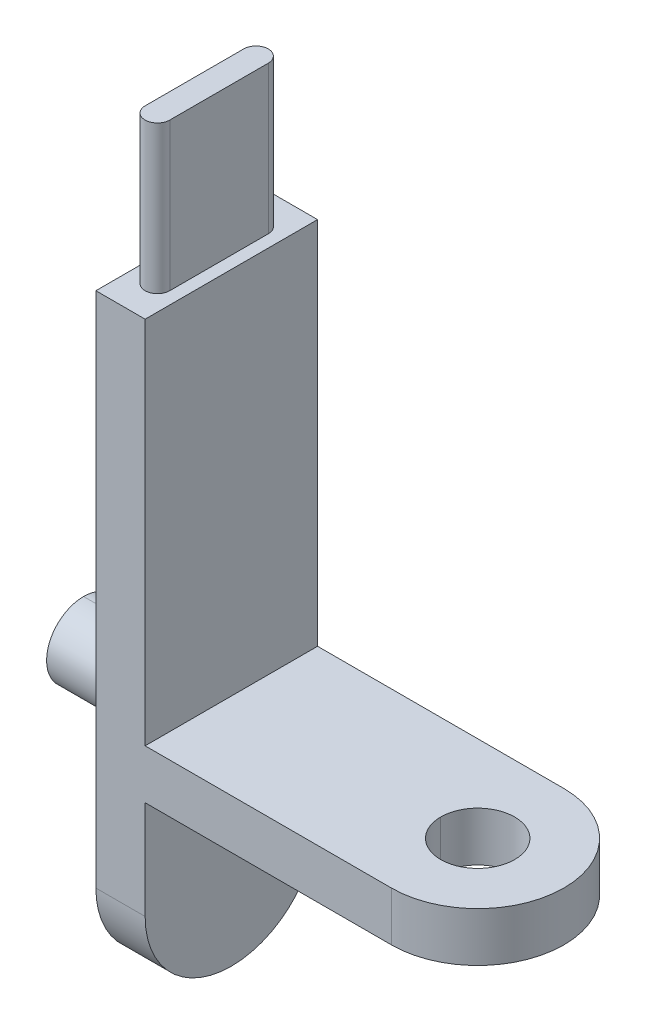
ISO-10303-21;
HEADER;
FILE_DESCRIPTION(('STEP AP214'),'2;1');
FILE_NAME('part.step','',(''),(''),'','','');
FILE_SCHEMA(('AUTOMOTIVE_DESIGN { 1 0 10303 214 1 1 1 1 }'));
ENDSEC;
DATA;
#1=APPLICATION_CONTEXT('core data for automotive mechanical design processes');
#2=APPLICATION_PROTOCOL_DEFINITION('international standard','automotive_design',2000,#1);
#3=PRODUCT_CONTEXT('',#1,'mechanical');
#4=PRODUCT('Part','Part','',(#3));
#5=PRODUCT_RELATED_PRODUCT_CATEGORY('part','',(#4));
#6=PRODUCT_DEFINITION_FORMATION('','',#4);
#7=PRODUCT_DEFINITION_CONTEXT('part definition',#1,'design');
#8=PRODUCT_DEFINITION('design','',#6,#7);
#9=PRODUCT_DEFINITION_SHAPE('','',#8);
#10=(LENGTH_UNIT() NAMED_UNIT(*) SI_UNIT(.MILLI.,.METRE.));
#11=(NAMED_UNIT(*) PLANE_ANGLE_UNIT() SI_UNIT($,.RADIAN.));
#12=(NAMED_UNIT(*) SI_UNIT($,.STERADIAN.) SOLID_ANGLE_UNIT());
#13=UNCERTAINTY_MEASURE_WITH_UNIT(LENGTH_MEASURE(1.E-05),#10,'distance_accuracy_value','');
#14=(GEOMETRIC_REPRESENTATION_CONTEXT(3) GLOBAL_UNCERTAINTY_ASSIGNED_CONTEXT((#13)) GLOBAL_UNIT_ASSIGNED_CONTEXT((#10,
#11,#12)) REPRESENTATION_CONTEXT('',''));
#15=CARTESIAN_POINT('',(0.,0.,0.));
#16=DIRECTION('',(0.,0.,1.));
#17=DIRECTION('',(1.,0.,0.));
#18=AXIS2_PLACEMENT_3D('',#15,#16,#17);
#19=CARTESIAN_POINT('',(0.,0.,-10.));
#20=DIRECTION('',(0.,1.,0.));
#21=DIRECTION('',(0.,0.,-1.));
#22=AXIS2_PLACEMENT_3D('',#19,#20,#21);
#23=CYLINDRICAL_SURFACE('',#22,2.5);
#24=DIRECTION('',(0.,1.,0.));
#25=VECTOR('',#24,1.);
#26=CARTESIAN_POINT('',(-2.5,0.,-10.));
#27=LINE('',#26,#25);
#28=CARTESIAN_POINT('',(-2.5,0.,-10.));
#29=VERTEX_POINT('',#28);
#30=CARTESIAN_POINT('',(-2.5,30.,-10.));
#31=VERTEX_POINT('',#30);
#32=EDGE_CURVE('E9',#29,#31,#27,.T.);
#33=ORIENTED_EDGE('',*,*,#32,.T.);
#34=CARTESIAN_POINT('',(0.,30.,-10.));
#35=DIRECTION('',(0.,1.,0.));
#36=DIRECTION('',(1.,0.,0.));
#37=AXIS2_PLACEMENT_3D('',#34,#35,#36);
#38=CIRCLE('',#37,2.5);
#39=CARTESIAN_POINT('',(2.5,30.,-10.));
#40=VERTEX_POINT('',#39);
#41=EDGE_CURVE('E250',#40,#31,#38,.T.);
#42=ORIENTED_EDGE('',*,*,#41,.F.);
#43=DIRECTION('',(0.,1.,0.));
#44=VECTOR('',#43,1.);
#45=CARTESIAN_POINT('',(2.5,0.,-10.));
#46=LINE('',#45,#44);
#47=CARTESIAN_POINT('',(2.5,0.,-10.));
#48=VERTEX_POINT('',#47);
#49=EDGE_CURVE('E155',#48,#40,#46,.T.);
#50=ORIENTED_EDGE('',*,*,#49,.F.);
#51=CARTESIAN_POINT('',(0.,0.,-10.));
#52=DIRECTION('',(0.,-1.,0.));
#53=DIRECTION('',(-1.,0.,0.));
#54=AXIS2_PLACEMENT_3D('',#51,#52,#53);
#55=CIRCLE('',#54,2.5);
#56=EDGE_CURVE('E153',#29,#48,#55,.T.);
#57=ORIENTED_EDGE('',*,*,#56,.F.);
#58=EDGE_LOOP('',(#33,#42,#50,#57));
#59=FACE_BOUND('',#58,.T.);
#60=ADVANCED_FACE('F15',(#59),#23,.T.);
#61=CARTESIAN_POINT('',(-2.5,0.,-10.));
#62=DIRECTION('',(-1.,0.,0.));
#63=DIRECTION('',(0.,0.,1.));
#64=AXIS2_PLACEMENT_3D('',#61,#62,#63);
#65=PLANE('',#64);
#66=DIRECTION('',(0.,1.,0.));
#67=VECTOR('',#66,1.);
#68=CARTESIAN_POINT('',(-2.5,0.,10.));
#69=LINE('',#68,#67);
#70=CARTESIAN_POINT('',(-2.5,0.,10.));
#71=VERTEX_POINT('',#70);
#72=CARTESIAN_POINT('',(-2.5,30.,10.));
#73=VERTEX_POINT('',#72);
#74=EDGE_CURVE('E251',#71,#73,#69,.T.);
#75=ORIENTED_EDGE('',*,*,#74,.T.);
#76=DIRECTION('',(0.,0.,1.));
#77=VECTOR('',#76,1.);
#78=CARTESIAN_POINT('',(-2.5,30.,-10.));
#79=LINE('',#78,#77);
#80=EDGE_CURVE('E26',#31,#73,#79,.T.);
#81=ORIENTED_EDGE('',*,*,#80,.F.);
#82=ORIENTED_EDGE('',*,*,#32,.F.);
#83=DIRECTION('',(0.,0.,1.));
#84=VECTOR('',#83,1.);
#85=CARTESIAN_POINT('',(-2.5,0.,-10.));
#86=LINE('',#85,#84);
#87=EDGE_CURVE('E149',#29,#71,#86,.T.);
#88=ORIENTED_EDGE('',*,*,#87,.T.);
#89=EDGE_LOOP('',(#75,#81,#82,#88));
#90=FACE_BOUND('',#89,.T.);
#91=ADVANCED_FACE('F147',(#90),#65,.T.);
#92=CARTESIAN_POINT('',(0.,30.,0.));
#93=DIRECTION('',(0.,1.,0.));
#94=DIRECTION('',(1.,0.,0.));
#95=AXIS2_PLACEMENT_3D('',#92,#93,#94);
#96=PLANE('',#95);
#97=DIRECTION('',(0.,0.,-1.));
#98=VECTOR('',#97,1.);
#99=CARTESIAN_POINT('',(2.5,30.,10.));
#100=LINE('',#99,#98);
#101=CARTESIAN_POINT('',(2.5,30.,10.));
#102=VERTEX_POINT('',#101);
#103=EDGE_CURVE('E259',#102,#40,#100,.T.);
#104=ORIENTED_EDGE('',*,*,#103,.T.);
#105=ORIENTED_EDGE('',*,*,#41,.T.);
#106=ORIENTED_EDGE('',*,*,#80,.T.);
#107=CARTESIAN_POINT('',(0.,30.,10.));
#108=DIRECTION('',(0.,1.,0.));
#109=DIRECTION('',(-1.,0.,0.));
#110=AXIS2_PLACEMENT_3D('',#107,#108,#109);
#111=CIRCLE('',#110,2.5);
#112=EDGE_CURVE('E247',#73,#102,#111,.T.);
#113=ORIENTED_EDGE('',*,*,#112,.T.);
#114=EDGE_LOOP('',(#104,#105,#106,#113));
#115=FACE_BOUND('',#114,.T.);
#116=ADVANCED_FACE('F419',(#115),#96,.T.);
#117=CARTESIAN_POINT('',(0.,0.,10.));
#118=DIRECTION('',(0.,1.,0.));
#119=DIRECTION('',(0.,0.,-1.));
#120=AXIS2_PLACEMENT_3D('',#117,#118,#119);
#121=CYLINDRICAL_SURFACE('',#120,2.5);
#122=ORIENTED_EDGE('',*,*,#74,.F.);
#123=CARTESIAN_POINT('',(0.,0.,10.));
#124=DIRECTION('',(0.,-1.,0.));
#125=DIRECTION('',(1.,0.,0.));
#126=AXIS2_PLACEMENT_3D('',#123,#124,#125);
#127=CIRCLE('',#126,2.5);
#128=CARTESIAN_POINT('',(2.5,0.,10.));
#129=VERTEX_POINT('',#128);
#130=EDGE_CURVE('E165',#129,#71,#127,.T.);
#131=ORIENTED_EDGE('',*,*,#130,.F.);
#132=DIRECTION('',(0.,1.,0.));
#133=VECTOR('',#132,1.);
#134=CARTESIAN_POINT('',(2.5,0.,10.));
#135=LINE('',#134,#133);
#136=EDGE_CURVE('E263',#129,#102,#135,.T.);
#137=ORIENTED_EDGE('',*,*,#136,.T.);
#138=ORIENTED_EDGE('',*,*,#112,.F.);
#139=EDGE_LOOP('',(#122,#131,#137,#138));
#140=FACE_BOUND('',#139,.T.);
#141=ADVANCED_FACE('F395',(#140),#121,.T.);
#142=CARTESIAN_POINT('',(2.5,0.,10.));
#143=DIRECTION('',(1.,0.,0.));
#144=DIRECTION('',(0.,1.,0.));
#145=AXIS2_PLACEMENT_3D('',#142,#143,#144);
#146=PLANE('',#145);
#147=ORIENTED_EDGE('',*,*,#49,.T.);
#148=ORIENTED_EDGE('',*,*,#103,.F.);
#149=ORIENTED_EDGE('',*,*,#136,.F.);
#150=DIRECTION('',(0.,0.,-1.));
#151=VECTOR('',#150,1.);
#152=CARTESIAN_POINT('',(2.5,0.,10.));
#153=LINE('',#152,#151);
#154=EDGE_CURVE('E160',#129,#48,#153,.T.);
#155=ORIENTED_EDGE('',*,*,#154,.T.);
#156=EDGE_LOOP('',(#147,#148,#149,#155));
#157=FACE_BOUND('',#156,.T.);
#158=ADVANCED_FACE('F390',(#157),#146,.T.);
#159=CARTESIAN_POINT('',(55.,0.,0.));
#160=DIRECTION('',(0.,1.,0.));
#161=DIRECTION('',(-1.,0.,0.));
#162=AXIS2_PLACEMENT_3D('',#159,#160,#161);
#163=CYLINDRICAL_SURFACE('',#162,7.5);
#164=DIRECTION('',(0.,-1.,0.));
#165=VECTOR('',#164,1.);
#166=CARTESIAN_POINT('',(62.5,-75.,0.));
#167=LINE('',#166,#165);
#168=CARTESIAN_POINT('',(62.5,-75.,0.));
#169=VERTEX_POINT('',#168);
#170=CARTESIAN_POINT('',(62.5,-85.,0.));
#171=VERTEX_POINT('',#170);
#172=EDGE_CURVE('E272',#169,#171,#167,.T.);
#173=ORIENTED_EDGE('',*,*,#172,.F.);
#174=CARTESIAN_POINT('',(55.,-75.,0.));
#175=DIRECTION('',(0.,1.,0.));
#176=DIRECTION('',(1.,0.,0.));
#177=AXIS2_PLACEMENT_3D('',#174,#175,#176);
#178=CIRCLE('',#177,7.5);
#179=CARTESIAN_POINT('',(47.5,-75.,0.));
#180=VERTEX_POINT('',#179);
#181=EDGE_CURVE('E285',#169,#180,#178,.T.);
#182=ORIENTED_EDGE('',*,*,#181,.T.);
#183=DIRECTION('',(0.,-1.,0.));
#184=VECTOR('',#183,1.);
#185=CARTESIAN_POINT('',(47.5,-75.,0.));
#186=LINE('',#185,#184);
#187=CARTESIAN_POINT('',(47.5,-85.,0.));
#188=VERTEX_POINT('',#187);
#189=EDGE_CURVE('E186',#180,#188,#186,.T.);
#190=ORIENTED_EDGE('',*,*,#189,.T.);
#191=CARTESIAN_POINT('',(55.,-85.,0.));
#192=DIRECTION('',(0.,1.,0.));
#193=DIRECTION('',(1.,0.,0.));
#194=AXIS2_PLACEMENT_3D('',#191,#192,#193);
#195=CIRCLE('',#194,7.5);
#196=EDGE_CURVE('E188',#171,#188,#195,.T.);
#197=ORIENTED_EDGE('',*,*,#196,.F.);
#198=EDGE_LOOP('',(#173,#182,#190,#197));
#199=FACE_BOUND('',#198,.T.);
#200=ADVANCED_FACE('F324',(#199),#163,.F.);
#201=CARTESIAN_POINT('',(55.,0.,0.));
#202=DIRECTION('',(0.,1.,0.));
#203=DIRECTION('',(-1.,0.,0.));
#204=AXIS2_PLACEMENT_3D('',#201,#202,#203);
#205=CYLINDRICAL_SURFACE('',#204,7.5);
#206=ORIENTED_EDGE('',*,*,#189,.F.);
#207=CARTESIAN_POINT('',(55.,-75.,0.));
#208=DIRECTION('',(0.,1.,0.));
#209=DIRECTION('',(-1.,0.,0.));
#210=AXIS2_PLACEMENT_3D('',#207,#208,#209);
#211=CIRCLE('',#210,7.5);
#212=EDGE_CURVE('E19',#180,#169,#211,.T.);
#213=ORIENTED_EDGE('',*,*,#212,.T.);
#214=ORIENTED_EDGE('',*,*,#172,.T.);
#215=CARTESIAN_POINT('',(55.,-85.,0.));
#216=DIRECTION('',(0.,1.,0.));
#217=DIRECTION('',(-1.,0.,0.));
#218=AXIS2_PLACEMENT_3D('',#215,#216,#217);
#219=CIRCLE('',#218,7.5);
#220=EDGE_CURVE('E187',#188,#171,#219,.T.);
#221=ORIENTED_EDGE('',*,*,#220,.F.);
#222=EDGE_LOOP('',(#206,#213,#214,#221));
#223=FACE_BOUND('',#222,.T.);
#224=ADVANCED_FACE('F312',(#223),#205,.F.);
#225=CARTESIAN_POINT('',(-5.,-105.,0.));
#226=DIRECTION('',(1.,0.,0.));
#227=DIRECTION('',(0.,-1.,0.));
#228=AXIS2_PLACEMENT_3D('',#225,#226,#227);
#229=CYLINDRICAL_SURFACE('',#228,17.5);
#230=DIRECTION('',(1.,0.,0.));
#231=VECTOR('',#230,1.);
#232=CARTESIAN_POINT('',(-5.,-105.,-17.5));
#233=LINE('',#232,#231);
#234=CARTESIAN_POINT('',(-5.,-105.,-17.5));
#235=VERTEX_POINT('',#234);
#236=CARTESIAN_POINT('',(5.,-105.,-17.5));
#237=VERTEX_POINT('',#236);
#238=EDGE_CURVE('E223',#235,#237,#233,.T.);
#239=ORIENTED_EDGE('',*,*,#238,.T.);
#240=CARTESIAN_POINT('',(5.,-105.,0.));
#241=DIRECTION('',(1.,0.,0.));
#242=DIRECTION('',(0.,0.,1.));
#243=AXIS2_PLACEMENT_3D('',#240,#241,#242);
#244=CIRCLE('',#243,17.5);
#245=CARTESIAN_POINT('',(5.,-105.,17.5));
#246=VERTEX_POINT('',#245);
#247=EDGE_CURVE('E182',#246,#237,#244,.T.);
#248=ORIENTED_EDGE('',*,*,#247,.F.);
#249=DIRECTION('',(1.,0.,0.));
#250=VECTOR('',#249,1.);
#251=CARTESIAN_POINT('',(-5.,-105.,17.5));
#252=LINE('',#251,#250);
#253=CARTESIAN_POINT('',(-5.,-105.,17.5));
#254=VERTEX_POINT('',#253);
#255=EDGE_CURVE('E178',#254,#246,#252,.T.);
#256=ORIENTED_EDGE('',*,*,#255,.F.);
#257=CARTESIAN_POINT('',(-5.,-105.,0.));
#258=DIRECTION('',(1.,0.,0.));
#259=DIRECTION('',(0.,0.,1.));
#260=AXIS2_PLACEMENT_3D('',#257,#258,#259);
#261=CIRCLE('',#260,17.5);
#262=EDGE_CURVE('E229',#254,#235,#261,.T.);
#263=ORIENTED_EDGE('',*,*,#262,.T.);
#264=EDGE_LOOP('',(#239,#248,#256,#263));
#265=FACE_BOUND('',#264,.T.);
#266=ADVANCED_FACE('F336',(#265),#229,.T.);
#267=CARTESIAN_POINT('',(5.,0.,0.));
#268=DIRECTION('',(1.,0.,0.));
#269=DIRECTION('',(0.,1.,0.));
#270=AXIS2_PLACEMENT_3D('',#267,#268,#269);
#271=PLANE('',#270);
#272=DIRECTION('',(0.,1.,0.));
#273=VECTOR('',#272,1.);
#274=CARTESIAN_POINT('',(5.,-75.,-17.5));
#275=LINE('',#274,#273);
#276=CARTESIAN_POINT('',(5.,-75.,-17.5));
#277=VERTEX_POINT('',#276);
#278=CARTESIAN_POINT('',(5.,0.,-17.5));
#279=VERTEX_POINT('',#278);
#280=EDGE_CURVE('E282',#277,#279,#275,.T.);
#281=ORIENTED_EDGE('',*,*,#280,.T.);
#282=DIRECTION('',(0.,0.,-1.));
#283=VECTOR('',#282,1.);
#284=CARTESIAN_POINT('',(5.,0.,17.5));
#285=LINE('',#284,#283);
#286=CARTESIAN_POINT('',(5.,0.,17.5));
#287=VERTEX_POINT('',#286);
#288=EDGE_CURVE('E276',#287,#279,#285,.T.);
#289=ORIENTED_EDGE('',*,*,#288,.F.);
#290=DIRECTION('',(0.,-1.,0.));
#291=VECTOR('',#290,1.);
#292=CARTESIAN_POINT('',(5.,0.,17.5));
#293=LINE('',#292,#291);
#294=CARTESIAN_POINT('',(5.,-75.,17.5));
#295=VERTEX_POINT('',#294);
#296=EDGE_CURVE('E76',#287,#295,#293,.T.);
#297=ORIENTED_EDGE('',*,*,#296,.T.);
#298=DIRECTION('',(0.,0.,-1.));
#299=VECTOR('',#298,1.);
#300=CARTESIAN_POINT('',(5.,-75.,17.5));
#301=LINE('',#300,#299);
#302=EDGE_CURVE('E194',#295,#277,#301,.T.);
#303=ORIENTED_EDGE('',*,*,#302,.T.);
#304=EDGE_LOOP('',(#281,#289,#297,#303));
#305=FACE_BOUND('',#304,.T.);
#306=ADVANCED_FACE('F349',(#305),#271,.T.);
#307=CARTESIAN_POINT('',(5.,0.,0.));
#308=DIRECTION('',(1.,0.,0.));
#309=DIRECTION('',(0.,1.,0.));
#310=AXIS2_PLACEMENT_3D('',#307,#308,#309);
#311=PLANE('',#310);
#312=DIRECTION('',(0.,-1.,0.));
#313=VECTOR('',#312,1.);
#314=CARTESIAN_POINT('',(5.,-85.,17.5));
#315=LINE('',#314,#313);
#316=CARTESIAN_POINT('',(5.,-85.,17.5));
#317=VERTEX_POINT('',#316);
#318=EDGE_CURVE('E181',#317,#246,#315,.T.);
#319=ORIENTED_EDGE('',*,*,#318,.T.);
#320=ORIENTED_EDGE('',*,*,#247,.T.);
#321=DIRECTION('',(0.,1.,0.));
#322=VECTOR('',#321,1.);
#323=CARTESIAN_POINT('',(5.,-105.,-17.5));
#324=LINE('',#323,#322);
#325=CARTESIAN_POINT('',(5.,-85.,-17.5));
#326=VERTEX_POINT('',#325);
#327=EDGE_CURVE('E221',#237,#326,#324,.T.);
#328=ORIENTED_EDGE('',*,*,#327,.T.);
#329=DIRECTION('',(0.,0.,1.));
#330=VECTOR('',#329,1.);
#331=CARTESIAN_POINT('',(5.,-85.,-17.5));
#332=LINE('',#331,#330);
#333=EDGE_CURVE('E191',#326,#317,#332,.T.);
#334=ORIENTED_EDGE('',*,*,#333,.T.);
#335=EDGE_LOOP('',(#319,#320,#328,#334));
#336=FACE_BOUND('',#335,.T.);
#337=ADVANCED_FACE('F344',(#336),#311,.T.);
#338=CARTESIAN_POINT('',(0.,-85.,0.));
#339=DIRECTION('',(0.,-1.,0.));
#340=DIRECTION('',(0.,0.,-1.));
#341=AXIS2_PLACEMENT_3D('',#338,#339,#340);
#342=PLANE('',#341);
#343=ORIENTED_EDGE('',*,*,#196,.T.);
#344=ORIENTED_EDGE('',*,*,#220,.T.);
#345=EDGE_LOOP('',(#343,#344));
#346=FACE_BOUND('',#345,.T.);
#347=ORIENTED_EDGE('',*,*,#333,.F.);
#348=DIRECTION('',(1.,0.,0.));
#349=VECTOR('',#348,1.);
#350=CARTESIAN_POINT('',(5.,-85.,-17.5));
#351=LINE('',#350,#349);
#352=CARTESIAN_POINT('',(55.,-85.,-17.5));
#353=VERTEX_POINT('',#352);
#354=EDGE_CURVE('E224',#326,#353,#351,.T.);
#355=ORIENTED_EDGE('',*,*,#354,.T.);
#356=CARTESIAN_POINT('',(55.,-85.,0.));
#357=DIRECTION('',(0.,-1.,0.));
#358=DIRECTION('',(0.,0.,-1.));
#359=AXIS2_PLACEMENT_3D('',#356,#357,#358);
#360=CIRCLE('',#359,17.5);
#361=CARTESIAN_POINT('',(55.,-85.,17.5));
#362=VERTEX_POINT('',#361);
#363=EDGE_CURVE('E195',#353,#362,#360,.T.);
#364=ORIENTED_EDGE('',*,*,#363,.T.);
#365=DIRECTION('',(1.,0.,0.));
#366=VECTOR('',#365,1.);
#367=CARTESIAN_POINT('',(5.,-85.,17.5));
#368=LINE('',#367,#366);
#369=EDGE_CURVE('E255',#317,#362,#368,.T.);
#370=ORIENTED_EDGE('',*,*,#369,.F.);
#371=EDGE_LOOP('',(#347,#355,#364,#370));
#372=FACE_BOUND('',#371,.T.);
#373=ADVANCED_FACE('F321',(#346,#372),#342,.T.);
#374=CARTESIAN_POINT('',(-5.,105.,17.5));
#375=DIRECTION('',(0.,0.,1.));
#376=DIRECTION('',(1.,0.,0.));
#377=AXIS2_PLACEMENT_3D('',#374,#375,#376);
#378=PLANE('',#377);
#379=DIRECTION('',(1.,0.,0.));
#380=VECTOR('',#379,1.);
#381=CARTESIAN_POINT('',(5.,-75.,17.5));
#382=LINE('',#381,#380);
#383=CARTESIAN_POINT('',(55.,-75.,17.5));
#384=VERTEX_POINT('',#383);
#385=EDGE_CURVE('E122',#295,#384,#382,.T.);
#386=ORIENTED_EDGE('',*,*,#385,.F.);
#387=ORIENTED_EDGE('',*,*,#296,.F.);
#388=DIRECTION('',(1.,0.,0.));
#389=VECTOR('',#388,1.);
#390=CARTESIAN_POINT('',(-5.,0.,17.5));
#391=LINE('',#390,#389);
#392=CARTESIAN_POINT('',(-5.,0.,17.5));
#393=VERTEX_POINT('',#392);
#394=EDGE_CURVE('E273',#393,#287,#391,.T.);
#395=ORIENTED_EDGE('',*,*,#394,.F.);
#396=DIRECTION('',(0.,-1.,0.));
#397=VECTOR('',#396,1.);
#398=CARTESIAN_POINT('',(-5.,0.,17.5));
#399=LINE('',#398,#397);
#400=EDGE_CURVE('E231',#393,#254,#399,.T.);
#401=ORIENTED_EDGE('',*,*,#400,.T.);
#402=ORIENTED_EDGE('',*,*,#255,.T.);
#403=ORIENTED_EDGE('',*,*,#318,.F.);
#404=ORIENTED_EDGE('',*,*,#369,.T.);
#405=DIRECTION('',(0.,1.,0.));
#406=VECTOR('',#405,1.);
#407=CARTESIAN_POINT('',(55.,-85.,17.5));
#408=LINE('',#407,#406);
#409=EDGE_CURVE('E204',#362,#384,#408,.T.);
#410=ORIENTED_EDGE('',*,*,#409,.T.);
#411=EDGE_LOOP('',(#386,#387,#395,#401,#402,#403,#404,#410));
#412=FACE_BOUND('',#411,.T.);
#413=ADVANCED_FACE('F17',(#412),#378,.T.);
#414=CARTESIAN_POINT('',(0.,-75.,-17.5));
#415=DIRECTION('',(0.,1.,0.));
#416=DIRECTION('',(1.,0.,0.));
#417=AXIS2_PLACEMENT_3D('',#414,#415,#416);
#418=PLANE('',#417);
#419=ORIENTED_EDGE('',*,*,#181,.F.);
#420=ORIENTED_EDGE('',*,*,#212,.F.);
#421=EDGE_LOOP('',(#419,#420));
#422=FACE_BOUND('',#421,.T.);
#423=ORIENTED_EDGE('',*,*,#302,.F.);
#424=ORIENTED_EDGE('',*,*,#385,.T.);
#425=CARTESIAN_POINT('',(55.,-75.,0.));
#426=DIRECTION('',(0.,1.,0.));
#427=DIRECTION('',(0.,0.,1.));
#428=AXIS2_PLACEMENT_3D('',#425,#426,#427);
#429=CIRCLE('',#428,17.5);
#430=CARTESIAN_POINT('',(55.,-75.,-17.5));
#431=VERTEX_POINT('',#430);
#432=EDGE_CURVE('E192',#384,#431,#429,.T.);
#433=ORIENTED_EDGE('',*,*,#432,.T.);
#434=DIRECTION('',(1.,0.,0.));
#435=VECTOR('',#434,1.);
#436=CARTESIAN_POINT('',(5.,-75.,-17.5));
#437=LINE('',#436,#435);
#438=EDGE_CURVE('E278',#277,#431,#437,.T.);
#439=ORIENTED_EDGE('',*,*,#438,.F.);
#440=EDGE_LOOP('',(#423,#424,#433,#439));
#441=FACE_BOUND('',#440,.T.);
#442=ADVANCED_FACE('F327',(#422,#441),#418,.T.);
#443=CARTESIAN_POINT('',(55.,0.,0.));
#444=DIRECTION('',(0.,1.,0.));
#445=DIRECTION('',(-1.,0.,0.));
#446=AXIS2_PLACEMENT_3D('',#443,#444,#445);
#447=CYLINDRICAL_SURFACE('',#446,17.5);
#448=ORIENTED_EDGE('',*,*,#409,.F.);
#449=ORIENTED_EDGE('',*,*,#363,.F.);
#450=DIRECTION('',(0.,1.,0.));
#451=VECTOR('',#450,1.);
#452=CARTESIAN_POINT('',(55.,-85.,-17.5));
#453=LINE('',#452,#451);
#454=EDGE_CURVE('E215',#353,#431,#453,.T.);
#455=ORIENTED_EDGE('',*,*,#454,.T.);
#456=ORIENTED_EDGE('',*,*,#432,.F.);
#457=EDGE_LOOP('',(#448,#449,#455,#456));
#458=FACE_BOUND('',#457,.T.);
#459=ADVANCED_FACE('F375',(#458),#447,.T.);
#460=CARTESIAN_POINT('',(-5.,-105.,-17.5));
#461=DIRECTION('',(0.,0.,-1.));
#462=DIRECTION('',(0.,-1.,0.));
#463=AXIS2_PLACEMENT_3D('',#460,#461,#462);
#464=PLANE('',#463);
#465=ORIENTED_EDGE('',*,*,#354,.F.);
#466=ORIENTED_EDGE('',*,*,#327,.F.);
#467=ORIENTED_EDGE('',*,*,#238,.F.);
#468=DIRECTION('',(0.,1.,0.));
#469=VECTOR('',#468,1.);
#470=CARTESIAN_POINT('',(-5.,-105.,-17.5));
#471=LINE('',#470,#469);
#472=CARTESIAN_POINT('',(-5.,0.,-17.5));
#473=VERTEX_POINT('',#472);
#474=EDGE_CURVE('E226',#235,#473,#471,.T.);
#475=ORIENTED_EDGE('',*,*,#474,.T.);
#476=DIRECTION('',(1.,0.,0.));
#477=VECTOR('',#476,1.);
#478=CARTESIAN_POINT('',(-5.,0.,-17.5));
#479=LINE('',#478,#477);
#480=EDGE_CURVE('E172',#473,#279,#479,.T.);
#481=ORIENTED_EDGE('',*,*,#480,.T.);
#482=ORIENTED_EDGE('',*,*,#280,.F.);
#483=ORIENTED_EDGE('',*,*,#438,.T.);
#484=ORIENTED_EDGE('',*,*,#454,.F.);
#485=EDGE_LOOP('',(#465,#466,#467,#475,#481,#482,#483,#484));
#486=FACE_BOUND('',#485,.T.);
#487=ADVANCED_FACE('F412',(#486),#464,.T.);
#488=CARTESIAN_POINT('',(-84.95,0.,43.62189032479));
#489=DIRECTION('',(0.,-1.,0.));
#490=DIRECTION('',(0.,0.,-1.));
#491=AXIS2_PLACEMENT_3D('',#488,#489,#490);
#492=PLANE('',#491);
#493=ORIENTED_EDGE('',*,*,#130,.T.);
#494=ORIENTED_EDGE('',*,*,#87,.F.);
#495=ORIENTED_EDGE('',*,*,#56,.T.);
#496=ORIENTED_EDGE('',*,*,#154,.F.);
#497=EDGE_LOOP('',(#493,#494,#495,#496));
#498=FACE_BOUND('',#497,.T.);
#499=ORIENTED_EDGE('',*,*,#394,.T.);
#500=ORIENTED_EDGE('',*,*,#288,.T.);
#501=ORIENTED_EDGE('',*,*,#480,.F.);
#502=DIRECTION('',(0.,0.,-1.));
#503=VECTOR('',#502,1.);
#504=CARTESIAN_POINT('',(-5.,0.,17.5));
#505=LINE('',#504,#503);
#506=EDGE_CURVE('E235',#393,#473,#505,.T.);
#507=ORIENTED_EDGE('',*,*,#506,.F.);
#508=EDGE_LOOP('',(#499,#500,#501,#507));
#509=FACE_BOUND('',#508,.T.);
#510=ADVANCED_FACE('F162',(#498,#509),#492,.F.);
#511=CARTESIAN_POINT('',(-25.,0.,0.));
#512=DIRECTION('',(1.,0.,0.));
#513=DIRECTION('',(0.,1.,0.));
#514=AXIS2_PLACEMENT_3D('',#511,#512,#513);
#515=PLANE('',#514);
#516=CARTESIAN_POINT('',(-25.,-80.,0.));
#517=DIRECTION('',(1.,0.,0.));
#518=DIRECTION('',(0.,1.,0.));
#519=AXIS2_PLACEMENT_3D('',#516,#517,#518);
#520=CIRCLE('',#519,7.5);
#521=CARTESIAN_POINT('',(-25.,-72.5,0.));
#522=VERTEX_POINT('',#521);
#523=CARTESIAN_POINT('',(-25.,-87.5,0.));
#524=VERTEX_POINT('',#523);
#525=EDGE_CURVE('E90',#522,#524,#520,.T.);
#526=ORIENTED_EDGE('',*,*,#525,.F.);
#527=CARTESIAN_POINT('',(-25.,-80.,0.));
#528=DIRECTION('',(1.,0.,0.));
#529=DIRECTION('',(0.,-1.,0.));
#530=AXIS2_PLACEMENT_3D('',#527,#528,#529);
#531=CIRCLE('',#530,7.5);
#532=EDGE_CURVE('E240',#524,#522,#531,.T.);
#533=ORIENTED_EDGE('',*,*,#532,.F.);
#534=EDGE_LOOP('',(#526,#533));
#535=FACE_BOUND('',#534,.T.);
#536=ADVANCED_FACE('F437',(#535),#515,.F.);
#537=CARTESIAN_POINT('',(0.,-80.,0.));
#538=DIRECTION('',(1.,0.,0.));
#539=DIRECTION('',(0.,-1.,0.));
#540=AXIS2_PLACEMENT_3D('',#537,#538,#539);
#541=CYLINDRICAL_SURFACE('',#540,7.5);
#542=DIRECTION('',(-1.,0.,0.));
#543=VECTOR('',#542,1.);
#544=CARTESIAN_POINT('',(-5.,-72.5,0.));
#545=LINE('',#544,#543);
#546=CARTESIAN_POINT('',(-5.,-72.5,0.));
#547=VERTEX_POINT('',#546);
#548=EDGE_CURVE('E219',#547,#522,#545,.T.);
#549=ORIENTED_EDGE('',*,*,#548,.T.);
#550=ORIENTED_EDGE('',*,*,#525,.T.);
#551=DIRECTION('',(-1.,0.,0.));
#552=VECTOR('',#551,1.);
#553=CARTESIAN_POINT('',(-5.,-87.5,0.));
#554=LINE('',#553,#552);
#555=CARTESIAN_POINT('',(-5.,-87.5,0.));
#556=VERTEX_POINT('',#555);
#557=EDGE_CURVE('E236',#556,#524,#554,.T.);
#558=ORIENTED_EDGE('',*,*,#557,.F.);
#559=CARTESIAN_POINT('',(-5.,-80.,0.));
#560=DIRECTION('',(1.,0.,0.));
#561=DIRECTION('',(0.,1.,0.));
#562=AXIS2_PLACEMENT_3D('',#559,#560,#561);
#563=CIRCLE('',#562,7.5);
#564=EDGE_CURVE('E243',#547,#556,#563,.T.);
#565=ORIENTED_EDGE('',*,*,#564,.F.);
#566=EDGE_LOOP('',(#549,#550,#558,#565));
#567=FACE_BOUND('',#566,.T.);
#568=ADVANCED_FACE('F363',(#567),#541,.T.);
#569=CARTESIAN_POINT('',(0.,-80.,0.));
#570=DIRECTION('',(1.,0.,0.));
#571=DIRECTION('',(0.,-1.,0.));
#572=AXIS2_PLACEMENT_3D('',#569,#570,#571);
#573=CYLINDRICAL_SURFACE('',#572,7.5);
#574=ORIENTED_EDGE('',*,*,#557,.T.);
#575=ORIENTED_EDGE('',*,*,#532,.T.);
#576=ORIENTED_EDGE('',*,*,#548,.F.);
#577=CARTESIAN_POINT('',(-5.,-80.,0.));
#578=DIRECTION('',(1.,0.,0.));
#579=DIRECTION('',(0.,-1.,0.));
#580=AXIS2_PLACEMENT_3D('',#577,#578,#579);
#581=CIRCLE('',#580,7.5);
#582=EDGE_CURVE('E176',#556,#547,#581,.T.);
#583=ORIENTED_EDGE('',*,*,#582,.F.);
#584=EDGE_LOOP('',(#574,#575,#576,#583));
#585=FACE_BOUND('',#584,.T.);
#586=ADVANCED_FACE('F357',(#585),#573,.T.);
#587=CARTESIAN_POINT('',(-5.,0.,0.));
#588=DIRECTION('',(1.,0.,0.));
#589=DIRECTION('',(0.,1.,0.));
#590=AXIS2_PLACEMENT_3D('',#587,#588,#589);
#591=PLANE('',#590);
#592=ORIENTED_EDGE('',*,*,#564,.T.);
#593=ORIENTED_EDGE('',*,*,#582,.T.);
#594=EDGE_LOOP('',(#592,#593));
#595=FACE_BOUND('',#594,.T.);
#596=ORIENTED_EDGE('',*,*,#474,.F.);
#597=ORIENTED_EDGE('',*,*,#262,.F.);
#598=ORIENTED_EDGE('',*,*,#400,.F.);
#599=ORIENTED_EDGE('',*,*,#506,.T.);
#600=EDGE_LOOP('',(#596,#597,#598,#599));
#601=FACE_BOUND('',#600,.T.);
#602=ADVANCED_FACE('F362',(#595,#601),#591,.F.);
#603=CLOSED_SHELL('',(#60,#91,#116,#141,#158,#200,#224,#266,#306,#337,#373,#413,#442,#459,#487,
#510,#536,#568,#586,#602));
#604=MANIFOLD_SOLID_BREP('B1',#603);
#605=ADVANCED_BREP_SHAPE_REPRESENTATION('',(#18,#604),#14);
#606=SHAPE_DEFINITION_REPRESENTATION(#9,#605);
ENDSEC;
END-ISO-10303-21;
